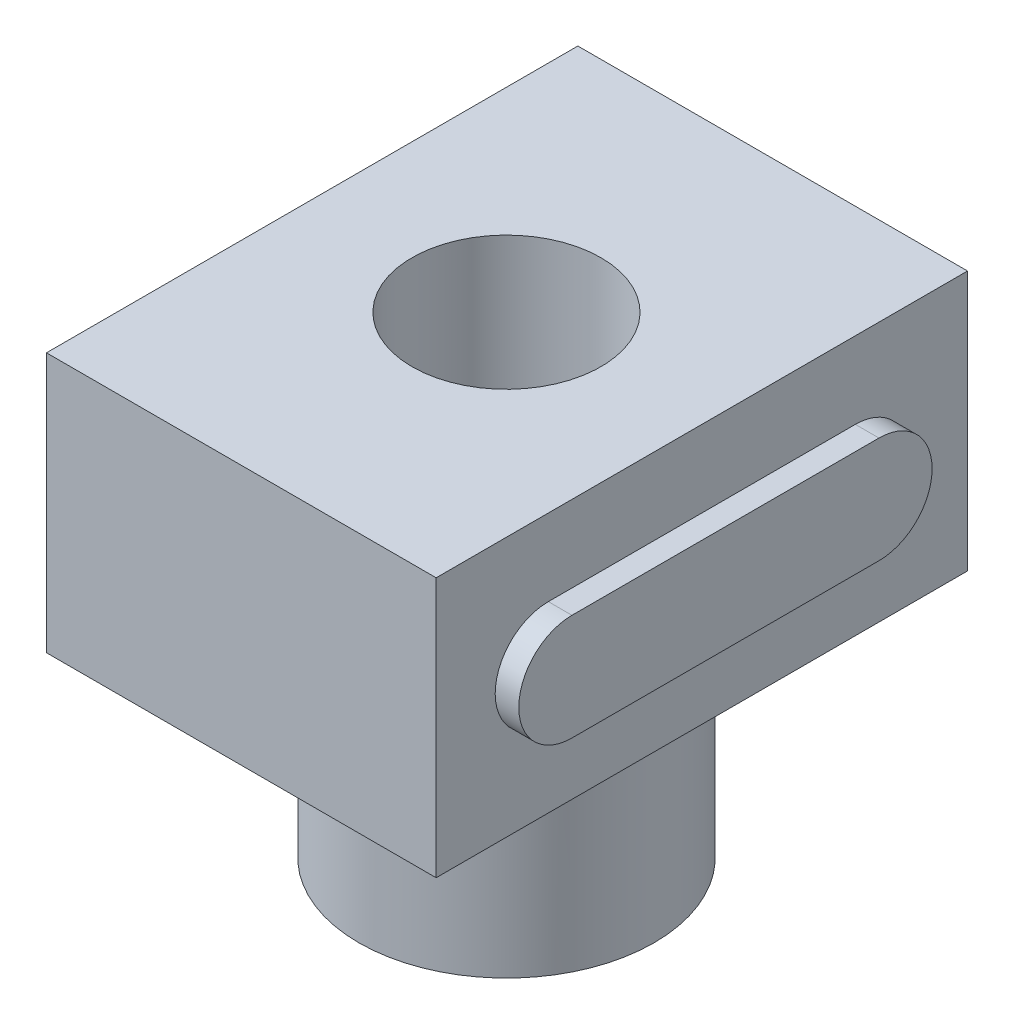
ISO-10303-21;
HEADER;
FILE_DESCRIPTION(('STEP AP214'),'2;1');
FILE_NAME('part.step','',(''),(''),'','','');
FILE_SCHEMA(('AUTOMOTIVE_DESIGN { 1 0 10303 214 1 1 1 1 }'));
ENDSEC;
DATA;
#1=APPLICATION_CONTEXT('core data for automotive mechanical design processes');
#2=APPLICATION_PROTOCOL_DEFINITION('international standard','automotive_design',2000,#1);
#3=PRODUCT_CONTEXT('',#1,'mechanical');
#4=PRODUCT('Part','Part','',(#3));
#5=PRODUCT_RELATED_PRODUCT_CATEGORY('part','',(#4));
#6=PRODUCT_DEFINITION_FORMATION('','',#4);
#7=PRODUCT_DEFINITION_CONTEXT('part definition',#1,'design');
#8=PRODUCT_DEFINITION('design','',#6,#7);
#9=PRODUCT_DEFINITION_SHAPE('','',#8);
#10=(LENGTH_UNIT() NAMED_UNIT(*) SI_UNIT(.MILLI.,.METRE.));
#11=(NAMED_UNIT(*) PLANE_ANGLE_UNIT() SI_UNIT($,.RADIAN.));
#12=(NAMED_UNIT(*) SI_UNIT($,.STERADIAN.) SOLID_ANGLE_UNIT());
#13=UNCERTAINTY_MEASURE_WITH_UNIT(LENGTH_MEASURE(1.E-05),#10,'distance_accuracy_value','');
#14=(GEOMETRIC_REPRESENTATION_CONTEXT(3) GLOBAL_UNCERTAINTY_ASSIGNED_CONTEXT((#13)) GLOBAL_UNIT_ASSIGNED_CONTEXT((#10,
#11,#12)) REPRESENTATION_CONTEXT('',''));
#15=CARTESIAN_POINT('',(0.,0.,0.));
#16=DIRECTION('',(0.,0.,1.));
#17=DIRECTION('',(1.,0.,0.));
#18=AXIS2_PLACEMENT_3D('',#15,#16,#17);
#19=CARTESIAN_POINT('',(-16.5,0.,0.));
#20=DIRECTION('',(1.,0.,0.));
#21=DIRECTION('',(0.,0.,-1.));
#22=AXIS2_PLACEMENT_3D('',#19,#20,#21);
#23=PLANE('',#22);
#24=DIRECTION('',(0.,0.,1.));
#25=VECTOR('',#24,1.);
#26=CARTESIAN_POINT('',(-16.5,18.,22.5446555438205));
#27=LINE('',#26,#25);
#28=CARTESIAN_POINT('',(-16.5,18.,-22.5446555438205));
#29=VERTEX_POINT('',#28);
#30=CARTESIAN_POINT('',(-16.5,18.,22.4553444561795));
#31=VERTEX_POINT('',#30);
#32=EDGE_CURVE('E197',#29,#31,#27,.T.);
#33=ORIENTED_EDGE('',*,*,#32,.T.);
#34=DIRECTION('',(0.,1.,0.));
#35=VECTOR('',#34,1.);
#36=CARTESIAN_POINT('',(-16.5,0.,22.4553444561795));
#37=LINE('',#36,#35);
#38=CARTESIAN_POINT('',(-16.5,40.,22.4553444561795));
#39=VERTEX_POINT('',#38);
#40=EDGE_CURVE('E181',#31,#39,#37,.T.);
#41=ORIENTED_EDGE('',*,*,#40,.T.);
#42=DIRECTION('',(0.,0.,-1.));
#43=VECTOR('',#42,1.);
#44=CARTESIAN_POINT('',(-16.5,40.,22.5446555438205));
#45=LINE('',#44,#43);
#46=CARTESIAN_POINT('',(-16.5,40.,-22.5446555438205));
#47=VERTEX_POINT('',#46);
#48=EDGE_CURVE('E200',#39,#47,#45,.T.);
#49=ORIENTED_EDGE('',*,*,#48,.T.);
#50=DIRECTION('',(0.,-1.,0.));
#51=VECTOR('',#50,1.);
#52=CARTESIAN_POINT('',(-16.5,40.,-22.5446555438205));
#53=LINE('',#52,#51);
#54=EDGE_CURVE('E194',#47,#29,#53,.T.);
#55=ORIENTED_EDGE('',*,*,#54,.T.);
#56=EDGE_LOOP('',(#33,#41,#49,#55));
#57=FACE_BOUND('',#56,.T.);
#58=CARTESIAN_POINT('',(-16.5,29.,-13.0446555438205));
#59=DIRECTION('',(-1.,0.,0.));
#60=DIRECTION('',(0.,0.,1.));
#61=AXIS2_PLACEMENT_3D('',#58,#59,#60);
#62=CIRCLE('',#61,4.5);
#63=CARTESIAN_POINT('',(-16.5,33.5,-13.0446555438205));
#64=VERTEX_POINT('',#63);
#65=CARTESIAN_POINT('',(-16.5,24.5,-13.0446555438205));
#66=VERTEX_POINT('',#65);
#67=EDGE_CURVE('E142',#64,#66,#62,.T.);
#68=ORIENTED_EDGE('',*,*,#67,.F.);
#69=DIRECTION('',(0.,0.,-1.));
#70=VECTOR('',#69,1.);
#71=CARTESIAN_POINT('',(-16.5,33.5,-13.0446555438205));
#72=LINE('',#71,#70);
#73=CARTESIAN_POINT('',(-16.5,33.5,12.9553444561795));
#74=VERTEX_POINT('',#73);
#75=EDGE_CURVE('E155',#74,#64,#72,.T.);
#76=ORIENTED_EDGE('',*,*,#75,.F.);
#77=CARTESIAN_POINT('',(-16.5,29.,12.9553444561795));
#78=DIRECTION('',(-1.,0.,0.));
#79=DIRECTION('',(0.,0.,1.));
#80=AXIS2_PLACEMENT_3D('',#77,#78,#79);
#81=CIRCLE('',#80,4.5);
#82=CARTESIAN_POINT('',(-16.5,24.5,12.9553444561795));
#83=VERTEX_POINT('',#82);
#84=EDGE_CURVE('E164',#83,#74,#81,.T.);
#85=ORIENTED_EDGE('',*,*,#84,.F.);
#86=DIRECTION('',(0.,0.,1.));
#87=VECTOR('',#86,1.);
#88=CARTESIAN_POINT('',(-16.5,24.5,-13.0446555438205));
#89=LINE('',#88,#87);
#90=EDGE_CURVE('E145',#66,#83,#89,.T.);
#91=ORIENTED_EDGE('',*,*,#90,.F.);
#92=EDGE_LOOP('',(#68,#76,#85,#91));
#93=FACE_BOUND('',#92,.T.);
#94=ADVANCED_FACE('F33',(#57,#93),#23,.F.);
#95=CARTESIAN_POINT('',(0.,30.,0.));
#96=DIRECTION('',(0.,-1.,0.));
#97=DIRECTION('',(0.,0.,-1.));
#98=AXIS2_PLACEMENT_3D('',#95,#96,#97);
#99=CYLINDRICAL_SURFACE('',#98,12.5);
#100=CARTESIAN_POINT('',(0.,18.,0.));
#101=DIRECTION('',(0.,-1.,0.));
#102=DIRECTION('',(0.,0.,-1.));
#103=AXIS2_PLACEMENT_3D('',#100,#101,#102);
#104=CIRCLE('',#103,12.5);
#105=CARTESIAN_POINT('',(0.,18.,-12.5));
#106=VERTEX_POINT('',#105);
#107=EDGE_CURVE('E206',#106,#106,#104,.T.);
#108=ORIENTED_EDGE('',*,*,#107,.T.);
#109=EDGE_LOOP('',(#108));
#110=FACE_BOUND('',#109,.T.);
#111=CARTESIAN_POINT('',(0.,0.,0.));
#112=DIRECTION('',(0.,1.,0.));
#113=DIRECTION('',(0.,0.,1.));
#114=AXIS2_PLACEMENT_3D('',#111,#112,#113);
#115=CIRCLE('',#114,12.5);
#116=CARTESIAN_POINT('',(0.,0.,12.5));
#117=VERTEX_POINT('',#116);
#118=EDGE_CURVE('E11',#117,#117,#115,.T.);
#119=ORIENTED_EDGE('',*,*,#118,.T.);
#120=EDGE_LOOP('',(#119));
#121=FACE_BOUND('',#120,.T.);
#122=ADVANCED_FACE('F35',(#110,#121),#99,.T.);
#123=CARTESIAN_POINT('',(0.,0.,0.));
#124=DIRECTION('',(0.,1.,0.));
#125=DIRECTION('',(0.,0.,1.));
#126=AXIS2_PLACEMENT_3D('',#123,#124,#125);
#127=PLANE('',#126);
#128=CARTESIAN_POINT('',(0.,0.,0.));
#129=DIRECTION('',(0.,1.,0.));
#130=DIRECTION('',(0.,0.,1.));
#131=AXIS2_PLACEMENT_3D('',#128,#129,#130);
#132=CIRCLE('',#131,8.);
#133=CARTESIAN_POINT('',(0.,0.,8.));
#134=VERTEX_POINT('',#133);
#135=EDGE_CURVE('E41',#134,#134,#132,.T.);
#136=ORIENTED_EDGE('',*,*,#135,.T.);
#137=EDGE_LOOP('',(#136));
#138=FACE_BOUND('',#137,.T.);
#139=ORIENTED_EDGE('',*,*,#118,.F.);
#140=EDGE_LOOP('',(#139));
#141=FACE_BOUND('',#140,.T.);
#142=ADVANCED_FACE('F216',(#138,#141),#127,.F.);
#143=CARTESIAN_POINT('',(0.,15.,0.));
#144=DIRECTION('',(0.,1.,0.));
#145=DIRECTION('',(0.,0.,1.));
#146=AXIS2_PLACEMENT_3D('',#143,#144,#145);
#147=CYLINDRICAL_SURFACE('',#146,8.);
#148=ORIENTED_EDGE('',*,*,#135,.F.);
#149=EDGE_LOOP('',(#148));
#150=FACE_BOUND('',#149,.T.);
#151=CARTESIAN_POINT('',(0.,40.,0.));
#152=DIRECTION('',(0.,-1.,0.));
#153=DIRECTION('',(0.,0.,-1.));
#154=AXIS2_PLACEMENT_3D('',#151,#152,#153);
#155=CIRCLE('',#154,8.);
#156=CARTESIAN_POINT('',(0.,40.,-8.));
#157=VERTEX_POINT('',#156);
#158=EDGE_CURVE('E226',#157,#157,#155,.T.);
#159=ORIENTED_EDGE('',*,*,#158,.F.);
#160=EDGE_LOOP('',(#159));
#161=FACE_BOUND('',#160,.T.);
#162=ADVANCED_FACE('F219',(#150,#161),#147,.F.);
#163=CARTESIAN_POINT('',(0.,18.,0.));
#164=DIRECTION('',(0.,-1.,0.));
#165=DIRECTION('',(0.,0.,-1.));
#166=AXIS2_PLACEMENT_3D('',#163,#164,#165);
#167=PLANE('',#166);
#168=DIRECTION('',(1.,0.,0.));
#169=VECTOR('',#168,1.);
#170=CARTESIAN_POINT('',(-12.5,18.,22.4553444561795));
#171=LINE('',#170,#169);
#172=CARTESIAN_POINT('',(16.5,18.,22.4553444561795));
#173=VERTEX_POINT('',#172);
#174=EDGE_CURVE('E207',#31,#173,#171,.T.);
#175=ORIENTED_EDGE('',*,*,#174,.F.);
#176=ORIENTED_EDGE('',*,*,#32,.F.);
#177=DIRECTION('',(1.,0.,0.));
#178=VECTOR('',#177,1.);
#179=CARTESIAN_POINT('',(-12.5,18.,-22.5446555438205));
#180=LINE('',#179,#178);
#181=CARTESIAN_POINT('',(16.5,18.,-22.5446555438205));
#182=VERTEX_POINT('',#181);
#183=EDGE_CURVE('E203',#29,#182,#180,.T.);
#184=ORIENTED_EDGE('',*,*,#183,.T.);
#185=DIRECTION('',(0.,0.,-1.));
#186=VECTOR('',#185,1.);
#187=CARTESIAN_POINT('',(16.5,18.,22.5446555438205));
#188=LINE('',#187,#186);
#189=EDGE_CURVE('E192',#173,#182,#188,.T.);
#190=ORIENTED_EDGE('',*,*,#189,.F.);
#191=EDGE_LOOP('',(#175,#176,#184,#190));
#192=FACE_BOUND('',#191,.T.);
#193=ORIENTED_EDGE('',*,*,#107,.F.);
#194=EDGE_LOOP('',(#193));
#195=FACE_BOUND('',#194,.T.);
#196=ADVANCED_FACE('F222',(#192,#195),#167,.T.);
#197=CARTESIAN_POINT('',(0.,40.,0.));
#198=DIRECTION('',(0.,-1.,0.));
#199=DIRECTION('',(0.,0.,-1.));
#200=AXIS2_PLACEMENT_3D('',#197,#198,#199);
#201=PLANE('',#200);
#202=ORIENTED_EDGE('',*,*,#158,.T.);
#203=EDGE_LOOP('',(#202));
#204=FACE_BOUND('',#203,.T.);
#205=ORIENTED_EDGE('',*,*,#48,.F.);
#206=DIRECTION('',(1.,0.,0.));
#207=VECTOR('',#206,1.);
#208=CARTESIAN_POINT('',(-12.5,40.,22.4553444561795));
#209=LINE('',#208,#207);
#210=CARTESIAN_POINT('',(16.5,40.,22.4553444561795));
#211=VERTEX_POINT('',#210);
#212=EDGE_CURVE('E209',#39,#211,#209,.T.);
#213=ORIENTED_EDGE('',*,*,#212,.T.);
#214=DIRECTION('',(0.,0.,1.));
#215=VECTOR('',#214,1.);
#216=CARTESIAN_POINT('',(16.5,40.,22.5446555438205));
#217=LINE('',#216,#215);
#218=CARTESIAN_POINT('',(16.5,40.,-22.5446555438205));
#219=VERTEX_POINT('',#218);
#220=EDGE_CURVE('E189',#219,#211,#217,.T.);
#221=ORIENTED_EDGE('',*,*,#220,.F.);
#222=DIRECTION('',(1.,0.,0.));
#223=VECTOR('',#222,1.);
#224=CARTESIAN_POINT('',(-12.5,40.,-22.5446555438205));
#225=LINE('',#224,#223);
#226=EDGE_CURVE('E202',#47,#219,#225,.T.);
#227=ORIENTED_EDGE('',*,*,#226,.F.);
#228=EDGE_LOOP('',(#205,#213,#221,#227));
#229=FACE_BOUND('',#228,.T.);
#230=ADVANCED_FACE('F266',(#204,#229),#201,.F.);
#231=CARTESIAN_POINT('',(-12.5,40.,-22.5446555438205));
#232=DIRECTION('',(0.,0.,-1.));
#233=DIRECTION('',(-1.,0.,0.));
#234=AXIS2_PLACEMENT_3D('',#231,#232,#233);
#235=PLANE('',#234);
#236=ORIENTED_EDGE('',*,*,#226,.T.);
#237=DIRECTION('',(0.,1.,0.));
#238=VECTOR('',#237,1.);
#239=CARTESIAN_POINT('',(16.5,40.,-22.5446555438205));
#240=LINE('',#239,#238);
#241=EDGE_CURVE('E184',#182,#219,#240,.T.);
#242=ORIENTED_EDGE('',*,*,#241,.F.);
#243=ORIENTED_EDGE('',*,*,#183,.F.);
#244=ORIENTED_EDGE('',*,*,#54,.F.);
#245=EDGE_LOOP('',(#236,#242,#243,#244));
#246=FACE_BOUND('',#245,.T.);
#247=ADVANCED_FACE('F262',(#246),#235,.T.);
#248=CARTESIAN_POINT('',(-12.5,40.,22.4553444561795));
#249=DIRECTION('',(0.,0.,1.));
#250=DIRECTION('',(1.,0.,0.));
#251=AXIS2_PLACEMENT_3D('',#248,#249,#250);
#252=PLANE('',#251);
#253=ORIENTED_EDGE('',*,*,#174,.T.);
#254=DIRECTION('',(0.,1.,0.));
#255=VECTOR('',#254,1.);
#256=CARTESIAN_POINT('',(16.5,0.,22.4553444561795));
#257=LINE('',#256,#255);
#258=EDGE_CURVE('E180',#173,#211,#257,.T.);
#259=ORIENTED_EDGE('',*,*,#258,.T.);
#260=ORIENTED_EDGE('',*,*,#212,.F.);
#261=ORIENTED_EDGE('',*,*,#40,.F.);
#262=EDGE_LOOP('',(#253,#259,#260,#261));
#263=FACE_BOUND('',#262,.T.);
#264=ADVANCED_FACE('F249',(#263),#252,.T.);
#265=CARTESIAN_POINT('',(16.5,0.,0.));
#266=DIRECTION('',(1.,0.,0.));
#267=DIRECTION('',(0.,0.,-1.));
#268=AXIS2_PLACEMENT_3D('',#265,#266,#267);
#269=PLANE('',#268);
#270=CARTESIAN_POINT('',(16.5,29.,12.9553444561795));
#271=DIRECTION('',(1.,0.,0.));
#272=DIRECTION('',(0.,0.,-1.));
#273=AXIS2_PLACEMENT_3D('',#270,#271,#272);
#274=CIRCLE('',#273,4.5);
#275=CARTESIAN_POINT('',(16.5,33.5,12.9553444561795));
#276=VERTEX_POINT('',#275);
#277=CARTESIAN_POINT('',(16.5,24.5,12.9553444561795));
#278=VERTEX_POINT('',#277);
#279=EDGE_CURVE('E48',#276,#278,#274,.T.);
#280=ORIENTED_EDGE('',*,*,#279,.F.);
#281=DIRECTION('',(0.,0.,1.));
#282=VECTOR('',#281,1.);
#283=CARTESIAN_POINT('',(16.5,33.5,12.9553444561795));
#284=LINE('',#283,#282);
#285=CARTESIAN_POINT('',(16.5,33.5,-13.0446555438205));
#286=VERTEX_POINT('',#285);
#287=EDGE_CURVE('E52',#286,#276,#284,.T.);
#288=ORIENTED_EDGE('',*,*,#287,.F.);
#289=CARTESIAN_POINT('',(16.5,29.,-13.0446555438205));
#290=DIRECTION('',(1.,0.,0.));
#291=DIRECTION('',(0.,0.,-1.));
#292=AXIS2_PLACEMENT_3D('',#289,#290,#291);
#293=CIRCLE('',#292,4.5);
#294=CARTESIAN_POINT('',(16.5,24.5,-13.0446555438205));
#295=VERTEX_POINT('',#294);
#296=EDGE_CURVE('E236',#295,#286,#293,.T.);
#297=ORIENTED_EDGE('',*,*,#296,.F.);
#298=DIRECTION('',(0.,0.,-1.));
#299=VECTOR('',#298,1.);
#300=CARTESIAN_POINT('',(16.5,24.5,12.9553444561795));
#301=LINE('',#300,#299);
#302=EDGE_CURVE('E229',#278,#295,#301,.T.);
#303=ORIENTED_EDGE('',*,*,#302,.F.);
#304=EDGE_LOOP('',(#280,#288,#297,#303));
#305=FACE_BOUND('',#304,.T.);
#306=ORIENTED_EDGE('',*,*,#258,.F.);
#307=ORIENTED_EDGE('',*,*,#189,.T.);
#308=ORIENTED_EDGE('',*,*,#241,.T.);
#309=ORIENTED_EDGE('',*,*,#220,.T.);
#310=EDGE_LOOP('',(#306,#307,#308,#309));
#311=FACE_BOUND('',#310,.T.);
#312=ADVANCED_FACE('F245',(#305,#311),#269,.T.);
#313=CARTESIAN_POINT('',(-18.5,29.,-13.0446555438205));
#314=DIRECTION('',(1.,0.,0.));
#315=DIRECTION('',(0.,0.,-1.));
#316=AXIS2_PLACEMENT_3D('',#313,#314,#315);
#317=CYLINDRICAL_SURFACE('',#316,4.5);
#318=ORIENTED_EDGE('',*,*,#67,.T.);
#319=DIRECTION('',(1.,0.,0.));
#320=VECTOR('',#319,1.);
#321=CARTESIAN_POINT('',(-18.5,24.5,-13.0446555438205));
#322=LINE('',#321,#320);
#323=CARTESIAN_POINT('',(-18.5,24.5,-13.0446555438205));
#324=VERTEX_POINT('',#323);
#325=EDGE_CURVE('E177',#324,#66,#322,.T.);
#326=ORIENTED_EDGE('',*,*,#325,.F.);
#327=CARTESIAN_POINT('',(-18.5,29.,-13.0446555438205));
#328=DIRECTION('',(-1.,0.,0.));
#329=DIRECTION('',(0.,0.,1.));
#330=AXIS2_PLACEMENT_3D('',#327,#328,#329);
#331=CIRCLE('',#330,4.5);
#332=CARTESIAN_POINT('',(-18.5,33.5,-13.0446555438205));
#333=VERTEX_POINT('',#332);
#334=EDGE_CURVE('E151',#333,#324,#331,.T.);
#335=ORIENTED_EDGE('',*,*,#334,.F.);
#336=DIRECTION('',(1.,0.,0.));
#337=VECTOR('',#336,1.);
#338=CARTESIAN_POINT('',(-18.5,33.5,-13.0446555438205));
#339=LINE('',#338,#337);
#340=EDGE_CURVE('E160',#333,#64,#339,.T.);
#341=ORIENTED_EDGE('',*,*,#340,.T.);
#342=EDGE_LOOP('',(#318,#326,#335,#341));
#343=FACE_BOUND('',#342,.T.);
#344=ADVANCED_FACE('F248',(#343),#317,.T.);
#345=CARTESIAN_POINT('',(-18.5,24.5,-13.0446555438205));
#346=DIRECTION('',(0.,1.,0.));
#347=DIRECTION('',(0.,0.,1.));
#348=AXIS2_PLACEMENT_3D('',#345,#346,#347);
#349=PLANE('',#348);
#350=ORIENTED_EDGE('',*,*,#90,.T.);
#351=DIRECTION('',(1.,0.,0.));
#352=VECTOR('',#351,1.);
#353=CARTESIAN_POINT('',(-18.5,24.5,12.9553444561795));
#354=LINE('',#353,#352);
#355=CARTESIAN_POINT('',(-18.5,24.5,12.9553444561795));
#356=VERTEX_POINT('',#355);
#357=EDGE_CURVE('E174',#356,#83,#354,.T.);
#358=ORIENTED_EDGE('',*,*,#357,.F.);
#359=DIRECTION('',(0.,0.,1.));
#360=VECTOR('',#359,1.);
#361=CARTESIAN_POINT('',(-18.5,24.5,-13.0446555438205));
#362=LINE('',#361,#360);
#363=EDGE_CURVE('E154',#324,#356,#362,.T.);
#364=ORIENTED_EDGE('',*,*,#363,.F.);
#365=ORIENTED_EDGE('',*,*,#325,.T.);
#366=EDGE_LOOP('',(#350,#358,#364,#365));
#367=FACE_BOUND('',#366,.T.);
#368=ADVANCED_FACE('F286',(#367),#349,.F.);
#369=CARTESIAN_POINT('',(-18.5,29.,12.9553444561795));
#370=DIRECTION('',(1.,0.,0.));
#371=DIRECTION('',(0.,0.,-1.));
#372=AXIS2_PLACEMENT_3D('',#369,#370,#371);
#373=CYLINDRICAL_SURFACE('',#372,4.5);
#374=ORIENTED_EDGE('',*,*,#84,.T.);
#375=DIRECTION('',(1.,0.,0.));
#376=VECTOR('',#375,1.);
#377=CARTESIAN_POINT('',(-18.5,33.5,12.9553444561795));
#378=LINE('',#377,#376);
#379=CARTESIAN_POINT('',(-18.5,33.5,12.9553444561795));
#380=VERTEX_POINT('',#379);
#381=EDGE_CURVE('E171',#380,#74,#378,.T.);
#382=ORIENTED_EDGE('',*,*,#381,.F.);
#383=CARTESIAN_POINT('',(-18.5,29.,12.9553444561795));
#384=DIRECTION('',(-1.,0.,0.));
#385=DIRECTION('',(0.,0.,1.));
#386=AXIS2_PLACEMENT_3D('',#383,#384,#385);
#387=CIRCLE('',#386,4.5);
#388=EDGE_CURVE('E157',#356,#380,#387,.T.);
#389=ORIENTED_EDGE('',*,*,#388,.F.);
#390=ORIENTED_EDGE('',*,*,#357,.T.);
#391=EDGE_LOOP('',(#374,#382,#389,#390));
#392=FACE_BOUND('',#391,.T.);
#393=ADVANCED_FACE('F284',(#392),#373,.T.);
#394=CARTESIAN_POINT('',(-18.5,33.5,-13.0446555438205));
#395=DIRECTION('',(0.,-1.,0.));
#396=DIRECTION('',(0.,0.,-1.));
#397=AXIS2_PLACEMENT_3D('',#394,#395,#396);
#398=PLANE('',#397);
#399=ORIENTED_EDGE('',*,*,#75,.T.);
#400=ORIENTED_EDGE('',*,*,#340,.F.);
#401=DIRECTION('',(0.,0.,-1.));
#402=VECTOR('',#401,1.);
#403=CARTESIAN_POINT('',(-18.5,33.5,-13.0446555438205));
#404=LINE('',#403,#402);
#405=EDGE_CURVE('E159',#380,#333,#404,.T.);
#406=ORIENTED_EDGE('',*,*,#405,.F.);
#407=ORIENTED_EDGE('',*,*,#381,.T.);
#408=EDGE_LOOP('',(#399,#400,#406,#407));
#409=FACE_BOUND('',#408,.T.);
#410=ADVANCED_FACE('F275',(#409),#398,.F.);
#411=CARTESIAN_POINT('',(-18.5,29.,-13.0446555438205));
#412=DIRECTION('',(-1.,0.,0.));
#413=DIRECTION('',(0.,0.,1.));
#414=AXIS2_PLACEMENT_3D('',#411,#412,#413);
#415=PLANE('',#414);
#416=ORIENTED_EDGE('',*,*,#334,.T.);
#417=ORIENTED_EDGE('',*,*,#363,.T.);
#418=ORIENTED_EDGE('',*,*,#388,.T.);
#419=ORIENTED_EDGE('',*,*,#405,.T.);
#420=EDGE_LOOP('',(#416,#417,#418,#419));
#421=FACE_BOUND('',#420,.T.);
#422=ADVANCED_FACE('F280',(#421),#415,.T.);
#423=CARTESIAN_POINT('',(18.5,29.,12.9553444561795));
#424=DIRECTION('',(-1.,0.,0.));
#425=DIRECTION('',(0.,0.,1.));
#426=AXIS2_PLACEMENT_3D('',#423,#424,#425);
#427=CYLINDRICAL_SURFACE('',#426,4.5);
#428=ORIENTED_EDGE('',*,*,#279,.T.);
#429=DIRECTION('',(-1.,0.,0.));
#430=VECTOR('',#429,1.);
#431=CARTESIAN_POINT('',(18.5,24.5,12.9553444561795));
#432=LINE('',#431,#430);
#433=CARTESIAN_POINT('',(18.5,24.5,12.9553444561795));
#434=VERTEX_POINT('',#433);
#435=EDGE_CURVE('E125',#434,#278,#432,.T.);
#436=ORIENTED_EDGE('',*,*,#435,.F.);
#437=CARTESIAN_POINT('',(18.5,29.,12.9553444561795));
#438=DIRECTION('',(1.,0.,0.));
#439=DIRECTION('',(0.,0.,-1.));
#440=AXIS2_PLACEMENT_3D('',#437,#438,#439);
#441=CIRCLE('',#440,4.5);
#442=CARTESIAN_POINT('',(18.5,33.5,12.9553444561795));
#443=VERTEX_POINT('',#442);
#444=EDGE_CURVE('E131',#443,#434,#441,.T.);
#445=ORIENTED_EDGE('',*,*,#444,.F.);
#446=DIRECTION('',(-1.,0.,0.));
#447=VECTOR('',#446,1.);
#448=CARTESIAN_POINT('',(18.5,33.5,12.9553444561795));
#449=LINE('',#448,#447);
#450=EDGE_CURVE('E233',#443,#276,#449,.T.);
#451=ORIENTED_EDGE('',*,*,#450,.T.);
#452=EDGE_LOOP('',(#428,#436,#445,#451));
#453=FACE_BOUND('',#452,.T.);
#454=ADVANCED_FACE('F141',(#453),#427,.T.);
#455=CARTESIAN_POINT('',(18.5,24.5,12.9553444561795));
#456=DIRECTION('',(0.,1.,0.));
#457=DIRECTION('',(0.,0.,1.));
#458=AXIS2_PLACEMENT_3D('',#455,#456,#457);
#459=PLANE('',#458);
#460=ORIENTED_EDGE('',*,*,#302,.T.);
#461=DIRECTION('',(-1.,0.,0.));
#462=VECTOR('',#461,1.);
#463=CARTESIAN_POINT('',(18.5,24.5,-13.0446555438205));
#464=LINE('',#463,#462);
#465=CARTESIAN_POINT('',(18.5,24.5,-13.0446555438205));
#466=VERTEX_POINT('',#465);
#467=EDGE_CURVE('E127',#466,#295,#464,.T.);
#468=ORIENTED_EDGE('',*,*,#467,.F.);
#469=DIRECTION('',(0.,0.,-1.));
#470=VECTOR('',#469,1.);
#471=CARTESIAN_POINT('',(18.5,24.5,12.9553444561795));
#472=LINE('',#471,#470);
#473=EDGE_CURVE('E120',#434,#466,#472,.T.);
#474=ORIENTED_EDGE('',*,*,#473,.F.);
#475=ORIENTED_EDGE('',*,*,#435,.T.);
#476=EDGE_LOOP('',(#460,#468,#474,#475));
#477=FACE_BOUND('',#476,.T.);
#478=ADVANCED_FACE('F123',(#477),#459,.F.);
#479=CARTESIAN_POINT('',(18.5,29.,-13.0446555438205));
#480=DIRECTION('',(-1.,0.,0.));
#481=DIRECTION('',(0.,0.,1.));
#482=AXIS2_PLACEMENT_3D('',#479,#480,#481);
#483=CYLINDRICAL_SURFACE('',#482,4.5);
#484=ORIENTED_EDGE('',*,*,#296,.T.);
#485=DIRECTION('',(-1.,0.,0.));
#486=VECTOR('',#485,1.);
#487=CARTESIAN_POINT('',(18.5,33.5,-13.0446555438205));
#488=LINE('',#487,#486);
#489=CARTESIAN_POINT('',(18.5,33.5,-13.0446555438205));
#490=VERTEX_POINT('',#489);
#491=EDGE_CURVE('E147',#490,#286,#488,.T.);
#492=ORIENTED_EDGE('',*,*,#491,.F.);
#493=CARTESIAN_POINT('',(18.5,29.,-13.0446555438205));
#494=DIRECTION('',(1.,0.,0.));
#495=DIRECTION('',(0.,0.,-1.));
#496=AXIS2_PLACEMENT_3D('',#493,#494,#495);
#497=CIRCLE('',#496,4.5);
#498=EDGE_CURVE('E130',#466,#490,#497,.T.);
#499=ORIENTED_EDGE('',*,*,#498,.F.);
#500=ORIENTED_EDGE('',*,*,#467,.T.);
#501=EDGE_LOOP('',(#484,#492,#499,#500));
#502=FACE_BOUND('',#501,.T.);
#503=ADVANCED_FACE('F244',(#502),#483,.T.);
#504=CARTESIAN_POINT('',(18.5,33.5,12.9553444561795));
#505=DIRECTION('',(0.,-1.,0.));
#506=DIRECTION('',(0.,0.,-1.));
#507=AXIS2_PLACEMENT_3D('',#504,#505,#506);
#508=PLANE('',#507);
#509=ORIENTED_EDGE('',*,*,#287,.T.);
#510=ORIENTED_EDGE('',*,*,#450,.F.);
#511=DIRECTION('',(0.,0.,1.));
#512=VECTOR('',#511,1.);
#513=CARTESIAN_POINT('',(18.5,33.5,12.9553444561795));
#514=LINE('',#513,#512);
#515=EDGE_CURVE('E136',#490,#443,#514,.T.);
#516=ORIENTED_EDGE('',*,*,#515,.F.);
#517=ORIENTED_EDGE('',*,*,#491,.T.);
#518=EDGE_LOOP('',(#509,#510,#516,#517));
#519=FACE_BOUND('',#518,.T.);
#520=ADVANCED_FACE('F242',(#519),#508,.F.);
#521=CARTESIAN_POINT('',(18.5,29.,12.9553444561795));
#522=DIRECTION('',(1.,0.,0.));
#523=DIRECTION('',(0.,0.,-1.));
#524=AXIS2_PLACEMENT_3D('',#521,#522,#523);
#525=PLANE('',#524);
#526=ORIENTED_EDGE('',*,*,#444,.T.);
#527=ORIENTED_EDGE('',*,*,#473,.T.);
#528=ORIENTED_EDGE('',*,*,#498,.T.);
#529=ORIENTED_EDGE('',*,*,#515,.T.);
#530=EDGE_LOOP('',(#526,#527,#528,#529));
#531=FACE_BOUND('',#530,.T.);
#532=ADVANCED_FACE('F134',(#531),#525,.T.);
#533=CLOSED_SHELL('',(#94,#122,#142,#162,#196,#230,#247,#264,#312,#344,#368,#393,#410,#422,#454,
#478,#503,#520,#532));
#534=MANIFOLD_SOLID_BREP('B2',#533);
#535=ADVANCED_BREP_SHAPE_REPRESENTATION('',(#18,#534),#14);
#536=SHAPE_DEFINITION_REPRESENTATION(#9,#535);
ENDSEC;
END-ISO-10303-21;
